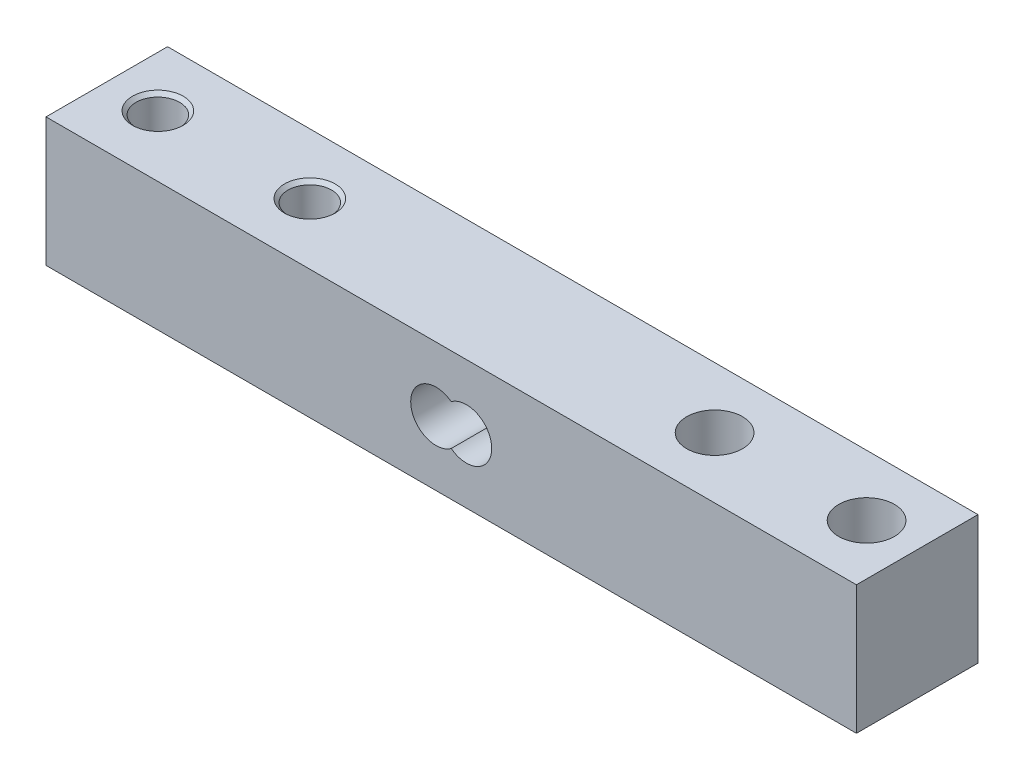
ISO-10303-21;
HEADER;
FILE_DESCRIPTION(('STEP AP214'),'2;1');
FILE_NAME('part.step','',(''),(''),'','','');
FILE_SCHEMA(('AUTOMOTIVE_DESIGN { 1 0 10303 214 1 1 1 1 }'));
ENDSEC;
DATA;
#1=APPLICATION_CONTEXT('core data for automotive mechanical design processes');
#2=APPLICATION_PROTOCOL_DEFINITION('international standard','automotive_design',2000,#1);
#3=PRODUCT_CONTEXT('',#1,'mechanical');
#4=PRODUCT('Part','Part','',(#3));
#5=PRODUCT_RELATED_PRODUCT_CATEGORY('part','',(#4));
#6=PRODUCT_DEFINITION_FORMATION('','',#4);
#7=PRODUCT_DEFINITION_CONTEXT('part definition',#1,'design');
#8=PRODUCT_DEFINITION('design','',#6,#7);
#9=PRODUCT_DEFINITION_SHAPE('','',#8);
#10=(LENGTH_UNIT() NAMED_UNIT(*) SI_UNIT(.MILLI.,.METRE.));
#11=(NAMED_UNIT(*) PLANE_ANGLE_UNIT() SI_UNIT($,.RADIAN.));
#12=(NAMED_UNIT(*) SI_UNIT($,.STERADIAN.) SOLID_ANGLE_UNIT());
#13=UNCERTAINTY_MEASURE_WITH_UNIT(LENGTH_MEASURE(1.E-05),#10,'distance_accuracy_value','');
#14=(GEOMETRIC_REPRESENTATION_CONTEXT(3) GLOBAL_UNCERTAINTY_ASSIGNED_CONTEXT((#13)) GLOBAL_UNIT_ASSIGNED_CONTEXT((#10,
#11,#12)) REPRESENTATION_CONTEXT('',''));
#15=CARTESIAN_POINT('',(0.,0.,0.));
#16=DIRECTION('',(0.,0.,1.));
#17=DIRECTION('',(1.,0.,0.));
#18=AXIS2_PLACEMENT_3D('',#15,#16,#17);
#19=CARTESIAN_POINT('',(-80.,0.,12.));
#20=DIRECTION('',(-1.,0.,0.));
#21=DIRECTION('',(0.,0.,1.));
#22=AXIS2_PLACEMENT_3D('',#19,#20,#21);
#23=PLANE('',#22);
#24=DIRECTION('',(0.,1.,0.));
#25=VECTOR('',#24,1.);
#26=CARTESIAN_POINT('',(-80.,0.,0.));
#27=LINE('',#26,#25);
#28=CARTESIAN_POINT('',(-80.,0.,0.));
#29=VERTEX_POINT('',#28);
#30=CARTESIAN_POINT('',(-80.,12.7,0.));
#31=VERTEX_POINT('',#30);
#32=EDGE_CURVE('E128',#29,#31,#27,.T.);
#33=ORIENTED_EDGE('',*,*,#32,.F.);
#34=DIRECTION('',(0.,0.,-1.));
#35=VECTOR('',#34,1.);
#36=CARTESIAN_POINT('',(-80.,0.,12.));
#37=LINE('',#36,#35);
#38=CARTESIAN_POINT('',(-80.,0.,12.));
#39=VERTEX_POINT('',#38);
#40=EDGE_CURVE('E11',#39,#29,#37,.T.);
#41=ORIENTED_EDGE('',*,*,#40,.F.);
#42=DIRECTION('',(0.,1.,0.));
#43=VECTOR('',#42,1.);
#44=CARTESIAN_POINT('',(-80.,0.,12.));
#45=LINE('',#44,#43);
#46=CARTESIAN_POINT('',(-80.,12.7,12.));
#47=VERTEX_POINT('',#46);
#48=EDGE_CURVE('E112',#39,#47,#45,.T.);
#49=ORIENTED_EDGE('',*,*,#48,.T.);
#50=DIRECTION('',(0.,0.,-1.));
#51=VECTOR('',#50,1.);
#52=CARTESIAN_POINT('',(-80.,12.7,12.));
#53=LINE('',#52,#51);
#54=EDGE_CURVE('E56',#47,#31,#53,.T.);
#55=ORIENTED_EDGE('',*,*,#54,.T.);
#56=EDGE_LOOP('',(#33,#41,#49,#55));
#57=FACE_BOUND('',#56,.T.);
#58=ADVANCED_FACE('F37',(#57),#23,.T.);
#59=CARTESIAN_POINT('',(0.,0.,12.));
#60=DIRECTION('',(0.,-1.,0.));
#61=DIRECTION('',(0.,0.,-1.));
#62=AXIS2_PLACEMENT_3D('',#59,#60,#61);
#63=PLANE('',#62);
#64=CARTESIAN_POINT('',(-20.,0.,6.));
#65=DIRECTION('',(0.,-1.,0.));
#66=DIRECTION('',(0.,0.,-1.));
#67=AXIS2_PLACEMENT_3D('',#64,#65,#66);
#68=CIRCLE('',#67,3.);
#69=CARTESIAN_POINT('',(-20.,0.,3.));
#70=VERTEX_POINT('',#69);
#71=EDGE_CURVE('E293',#70,#70,#68,.T.);
#72=ORIENTED_EDGE('',*,*,#71,.F.);
#73=EDGE_LOOP('',(#72));
#74=FACE_BOUND('',#73,.T.);
#75=CARTESIAN_POINT('',(-5.,0.,6.));
#76=DIRECTION('',(0.,-1.,0.));
#77=DIRECTION('',(0.,0.,-1.));
#78=AXIS2_PLACEMENT_3D('',#75,#76,#77);
#79=CIRCLE('',#78,3.);
#80=CARTESIAN_POINT('',(-5.,0.,3.));
#81=VERTEX_POINT('',#80);
#82=EDGE_CURVE('E299',#81,#81,#79,.T.);
#83=ORIENTED_EDGE('',*,*,#82,.F.);
#84=EDGE_LOOP('',(#83));
#85=FACE_BOUND('',#84,.T.);
#86=CARTESIAN_POINT('',(-75.,0.,5.95895265821062));
#87=DIRECTION('',(0.,1.,0.));
#88=DIRECTION('',(0.,0.,1.));
#89=AXIS2_PLACEMENT_3D('',#86,#87,#88);
#90=CIRCLE('',#89,2.14999999999999);
#91=CARTESIAN_POINT('',(-75.,0.,8.1089526582106));
#92=VERTEX_POINT('',#91);
#93=EDGE_CURVE('E314',#92,#92,#90,.T.);
#94=ORIENTED_EDGE('',*,*,#93,.T.);
#95=EDGE_LOOP('',(#94));
#96=FACE_BOUND('',#95,.T.);
#97=CARTESIAN_POINT('',(-60.,0.,5.95895265821062));
#98=DIRECTION('',(0.,1.,0.));
#99=DIRECTION('',(0.,0.,1.));
#100=AXIS2_PLACEMENT_3D('',#97,#98,#99);
#101=CIRCLE('',#100,2.14999999999999);
#102=CARTESIAN_POINT('',(-60.,0.,8.1089526582106));
#103=VERTEX_POINT('',#102);
#104=EDGE_CURVE('E125',#103,#103,#101,.T.);
#105=ORIENTED_EDGE('',*,*,#104,.T.);
#106=EDGE_LOOP('',(#105));
#107=FACE_BOUND('',#106,.T.);
#108=DIRECTION('',(-1.,0.,0.));
#109=VECTOR('',#108,1.);
#110=CARTESIAN_POINT('',(0.,0.,0.));
#111=LINE('',#110,#109);
#112=CARTESIAN_POINT('',(0.,0.,0.));
#113=VERTEX_POINT('',#112);
#114=EDGE_CURVE('E101',#113,#29,#111,.T.);
#115=ORIENTED_EDGE('',*,*,#114,.F.);
#116=DIRECTION('',(0.,0.,-1.));
#117=VECTOR('',#116,1.);
#118=CARTESIAN_POINT('',(0.,0.,12.));
#119=LINE('',#118,#117);
#120=CARTESIAN_POINT('',(0.,0.,12.));
#121=VERTEX_POINT('',#120);
#122=EDGE_CURVE('E47',#121,#113,#119,.T.);
#123=ORIENTED_EDGE('',*,*,#122,.F.);
#124=DIRECTION('',(-1.,0.,0.));
#125=VECTOR('',#124,1.);
#126=CARTESIAN_POINT('',(0.,0.,12.));
#127=LINE('',#126,#125);
#128=EDGE_CURVE('E99',#121,#39,#127,.T.);
#129=ORIENTED_EDGE('',*,*,#128,.T.);
#130=ORIENTED_EDGE('',*,*,#40,.T.);
#131=EDGE_LOOP('',(#115,#123,#129,#130));
#132=FACE_BOUND('',#131,.T.);
#133=ADVANCED_FACE('F98',(#74,#85,#96,#107,#132),#63,.T.);
#134=CARTESIAN_POINT('',(0.,0.,12.));
#135=DIRECTION('',(1.,0.,0.));
#136=DIRECTION('',(0.,1.,0.));
#137=AXIS2_PLACEMENT_3D('',#134,#135,#136);
#138=PLANE('',#137);
#139=DIRECTION('',(0.,-1.,0.));
#140=VECTOR('',#139,1.);
#141=CARTESIAN_POINT('',(0.,0.,0.));
#142=LINE('',#141,#140);
#143=CARTESIAN_POINT('',(0.,12.7,0.));
#144=VERTEX_POINT('',#143);
#145=EDGE_CURVE('E131',#144,#113,#142,.T.);
#146=ORIENTED_EDGE('',*,*,#145,.F.);
#147=DIRECTION('',(0.,0.,-1.));
#148=VECTOR('',#147,1.);
#149=CARTESIAN_POINT('',(0.,12.7,12.));
#150=LINE('',#149,#148);
#151=CARTESIAN_POINT('',(0.,12.7,12.));
#152=VERTEX_POINT('',#151);
#153=EDGE_CURVE('E75',#152,#144,#150,.T.);
#154=ORIENTED_EDGE('',*,*,#153,.F.);
#155=DIRECTION('',(0.,-1.,0.));
#156=VECTOR('',#155,1.);
#157=CARTESIAN_POINT('',(0.,0.,12.));
#158=LINE('',#157,#156);
#159=EDGE_CURVE('E111',#152,#121,#158,.T.);
#160=ORIENTED_EDGE('',*,*,#159,.T.);
#161=ORIENTED_EDGE('',*,*,#122,.T.);
#162=EDGE_LOOP('',(#146,#154,#160,#161));
#163=FACE_BOUND('',#162,.T.);
#164=ADVANCED_FACE('F114',(#163),#138,.T.);
#165=CARTESIAN_POINT('',(-38.5,6.35,12.));
#166=DIRECTION('',(0.,0.,-1.));
#167=DIRECTION('',(-1.,0.,0.));
#168=AXIS2_PLACEMENT_3D('',#165,#166,#167);
#169=CYLINDRICAL_SURFACE('',#168,2.5);
#170=CARTESIAN_POINT('',(-38.5,6.35,0.));
#171=DIRECTION('',(0.,0.,1.));
#172=DIRECTION('',(1.,0.,0.));
#173=AXIS2_PLACEMENT_3D('',#170,#171,#172);
#174=CIRCLE('',#173,2.5);
#175=CARTESIAN_POINT('',(-40.,4.35,0.));
#176=VERTEX_POINT('',#175);
#177=CARTESIAN_POINT('',(-40.,8.35,0.));
#178=VERTEX_POINT('',#177);
#179=EDGE_CURVE('E121',#176,#178,#174,.T.);
#180=ORIENTED_EDGE('',*,*,#179,.F.);
#181=DIRECTION('',(0.,0.,-1.));
#182=VECTOR('',#181,1.);
#183=CARTESIAN_POINT('',(-40.,4.35,12.));
#184=LINE('',#183,#182);
#185=CARTESIAN_POINT('',(-40.,4.35,12.));
#186=VERTEX_POINT('',#185);
#187=EDGE_CURVE('E41',#186,#176,#184,.T.);
#188=ORIENTED_EDGE('',*,*,#187,.F.);
#189=CARTESIAN_POINT('',(-38.5,6.35,12.));
#190=DIRECTION('',(0.,0.,1.));
#191=DIRECTION('',(1.,0.,0.));
#192=AXIS2_PLACEMENT_3D('',#189,#190,#191);
#193=CIRCLE('',#192,2.5);
#194=CARTESIAN_POINT('',(-40.,8.35,12.));
#195=VERTEX_POINT('',#194);
#196=EDGE_CURVE('E136',#186,#195,#193,.T.);
#197=ORIENTED_EDGE('',*,*,#196,.T.);
#198=DIRECTION('',(0.,0.,-1.));
#199=VECTOR('',#198,1.);
#200=CARTESIAN_POINT('',(-40.,8.35,12.));
#201=LINE('',#200,#199);
#202=EDGE_CURVE('E117',#195,#178,#201,.T.);
#203=ORIENTED_EDGE('',*,*,#202,.T.);
#204=EDGE_LOOP('',(#180,#188,#197,#203));
#205=FACE_BOUND('',#204,.T.);
#206=ADVANCED_FACE('F39',(#205),#169,.F.);
#207=CARTESIAN_POINT('',(-41.5,6.35,12.));
#208=DIRECTION('',(0.,0.,-1.));
#209=DIRECTION('',(-1.,0.,0.));
#210=AXIS2_PLACEMENT_3D('',#207,#208,#209);
#211=CYLINDRICAL_SURFACE('',#210,2.5);
#212=CARTESIAN_POINT('',(-41.5,6.35,0.));
#213=DIRECTION('',(0.,0.,1.));
#214=DIRECTION('',(1.,0.,0.));
#215=AXIS2_PLACEMENT_3D('',#212,#213,#214);
#216=CIRCLE('',#215,2.5);
#217=EDGE_CURVE('E124',#178,#176,#216,.T.);
#218=ORIENTED_EDGE('',*,*,#217,.F.);
#219=ORIENTED_EDGE('',*,*,#202,.F.);
#220=CARTESIAN_POINT('',(-41.5,6.35,12.));
#221=DIRECTION('',(0.,0.,1.));
#222=DIRECTION('',(1.,0.,0.));
#223=AXIS2_PLACEMENT_3D('',#220,#221,#222);
#224=CIRCLE('',#223,2.5);
#225=EDGE_CURVE('E143',#195,#186,#224,.T.);
#226=ORIENTED_EDGE('',*,*,#225,.T.);
#227=ORIENTED_EDGE('',*,*,#187,.T.);
#228=EDGE_LOOP('',(#218,#219,#226,#227));
#229=FACE_BOUND('',#228,.T.);
#230=ADVANCED_FACE('F141',(#229),#211,.F.);
#231=CARTESIAN_POINT('',(0.,12.7,12.));
#232=DIRECTION('',(0.,1.,0.));
#233=DIRECTION('',(0.,0.,1.));
#234=AXIS2_PLACEMENT_3D('',#231,#232,#233);
#235=PLANE('',#234);
#236=CARTESIAN_POINT('',(-20.,12.7,6.));
#237=DIRECTION('',(0.,-1.,0.));
#238=DIRECTION('',(0.,0.,-1.));
#239=AXIS2_PLACEMENT_3D('',#236,#237,#238);
#240=CIRCLE('',#239,2.75);
#241=CARTESIAN_POINT('',(-20.,12.7,3.25));
#242=VERTEX_POINT('',#241);
#243=EDGE_CURVE('E295',#242,#242,#240,.T.);
#244=ORIENTED_EDGE('',*,*,#243,.T.);
#245=EDGE_LOOP('',(#244));
#246=FACE_BOUND('',#245,.T.);
#247=CARTESIAN_POINT('',(-5.,12.7,6.));
#248=DIRECTION('',(0.,-1.,0.));
#249=DIRECTION('',(0.,0.,-1.));
#250=AXIS2_PLACEMENT_3D('',#247,#248,#249);
#251=CIRCLE('',#250,2.75);
#252=CARTESIAN_POINT('',(-5.,12.7,3.25));
#253=VERTEX_POINT('',#252);
#254=EDGE_CURVE('E305',#253,#253,#251,.T.);
#255=ORIENTED_EDGE('',*,*,#254,.T.);
#256=EDGE_LOOP('',(#255));
#257=FACE_BOUND('',#256,.T.);
#258=CARTESIAN_POINT('',(-75.,12.7,5.95895265821062));
#259=DIRECTION('',(0.,1.,0.));
#260=DIRECTION('',(0.,0.,1.));
#261=AXIS2_PLACEMENT_3D('',#258,#259,#260);
#262=CIRCLE('',#261,2.5);
#263=CARTESIAN_POINT('',(-75.,12.7,8.45895265821062));
#264=VERTEX_POINT('',#263);
#265=EDGE_CURVE('E308',#264,#264,#262,.T.);
#266=ORIENTED_EDGE('',*,*,#265,.F.);
#267=EDGE_LOOP('',(#266));
#268=FACE_BOUND('',#267,.T.);
#269=CARTESIAN_POINT('',(-60.,12.7,5.95895265821062));
#270=DIRECTION('',(0.,1.,0.));
#271=DIRECTION('',(0.,0.,1.));
#272=AXIS2_PLACEMENT_3D('',#269,#270,#271);
#273=CIRCLE('',#272,2.5);
#274=CARTESIAN_POINT('',(-60.,12.7,8.45895265821062));
#275=VERTEX_POINT('',#274);
#276=EDGE_CURVE('E317',#275,#275,#273,.T.);
#277=ORIENTED_EDGE('',*,*,#276,.F.);
#278=EDGE_LOOP('',(#277));
#279=FACE_BOUND('',#278,.T.);
#280=DIRECTION('',(1.,0.,0.));
#281=VECTOR('',#280,1.);
#282=CARTESIAN_POINT('',(0.,12.7,0.));
#283=LINE('',#282,#281);
#284=EDGE_CURVE('E133',#31,#144,#283,.T.);
#285=ORIENTED_EDGE('',*,*,#284,.F.);
#286=ORIENTED_EDGE('',*,*,#54,.F.);
#287=DIRECTION('',(1.,0.,0.));
#288=VECTOR('',#287,1.);
#289=CARTESIAN_POINT('',(0.,12.7,12.));
#290=LINE('',#289,#288);
#291=EDGE_CURVE('E115',#47,#152,#290,.T.);
#292=ORIENTED_EDGE('',*,*,#291,.T.);
#293=ORIENTED_EDGE('',*,*,#153,.T.);
#294=EDGE_LOOP('',(#285,#286,#292,#293));
#295=FACE_BOUND('',#294,.T.);
#296=ADVANCED_FACE('F150',(#246,#257,#268,#279,#295),#235,.T.);
#297=CARTESIAN_POINT('',(0.,0.,12.));
#298=DIRECTION('',(0.,0.,1.));
#299=DIRECTION('',(1.,0.,0.));
#300=AXIS2_PLACEMENT_3D('',#297,#298,#299);
#301=PLANE('',#300);
#302=ORIENTED_EDGE('',*,*,#196,.F.);
#303=ORIENTED_EDGE('',*,*,#225,.F.);
#304=EDGE_LOOP('',(#302,#303));
#305=FACE_BOUND('',#304,.T.);
#306=ORIENTED_EDGE('',*,*,#48,.F.);
#307=ORIENTED_EDGE('',*,*,#128,.F.);
#308=ORIENTED_EDGE('',*,*,#159,.F.);
#309=ORIENTED_EDGE('',*,*,#291,.F.);
#310=EDGE_LOOP('',(#306,#307,#308,#309));
#311=FACE_BOUND('',#310,.T.);
#312=ADVANCED_FACE('F109',(#305,#311),#301,.T.);
#313=CARTESIAN_POINT('',(0.,0.,0.));
#314=DIRECTION('',(0.,0.,1.));
#315=DIRECTION('',(1.,0.,0.));
#316=AXIS2_PLACEMENT_3D('',#313,#314,#315);
#317=PLANE('',#316);
#318=ORIENTED_EDGE('',*,*,#179,.T.);
#319=ORIENTED_EDGE('',*,*,#217,.T.);
#320=EDGE_LOOP('',(#318,#319));
#321=FACE_BOUND('',#320,.T.);
#322=ORIENTED_EDGE('',*,*,#32,.T.);
#323=ORIENTED_EDGE('',*,*,#284,.T.);
#324=ORIENTED_EDGE('',*,*,#145,.T.);
#325=ORIENTED_EDGE('',*,*,#114,.T.);
#326=EDGE_LOOP('',(#322,#323,#324,#325));
#327=FACE_BOUND('',#326,.T.);
#328=ADVANCED_FACE('F145',(#321,#327),#317,.F.);
#329=CARTESIAN_POINT('',(-60.,12.7,5.95895265821062));
#330=DIRECTION('',(0.,1.,0.));
#331=DIRECTION('',(0.,0.,1.));
#332=AXIS2_PLACEMENT_3D('',#329,#330,#331);
#333=CYLINDRICAL_SURFACE('',#332,2.14999999999999);
#334=ORIENTED_EDGE('',*,*,#104,.F.);
#335=EDGE_LOOP('',(#334));
#336=FACE_BOUND('',#335,.T.);
#337=CARTESIAN_POINT('',(-60.,12.35,5.95895265821062));
#338=DIRECTION('',(0.,1.,0.));
#339=DIRECTION('',(0.,0.,1.));
#340=AXIS2_PLACEMENT_3D('',#337,#338,#339);
#341=CIRCLE('',#340,2.15);
#342=CARTESIAN_POINT('',(-60.,12.35,8.10895265821062));
#343=VERTEX_POINT('',#342);
#344=EDGE_CURVE('E320',#343,#343,#341,.T.);
#345=ORIENTED_EDGE('',*,*,#344,.T.);
#346=EDGE_LOOP('',(#345));
#347=FACE_BOUND('',#346,.T.);
#348=ADVANCED_FACE('F148',(#336,#347),#333,.F.);
#349=CARTESIAN_POINT('',(-60.,12.7,5.95895265821062));
#350=DIRECTION('',(0.,1.,0.));
#351=DIRECTION('',(0.,0.,1.));
#352=AXIS2_PLACEMENT_3D('',#349,#350,#351);
#353=CONICAL_SURFACE('',#352,2.5,0.785398163397448);
#354=ORIENTED_EDGE('',*,*,#344,.F.);
#355=EDGE_LOOP('',(#354));
#356=FACE_BOUND('',#355,.T.);
#357=ORIENTED_EDGE('',*,*,#276,.T.);
#358=EDGE_LOOP('',(#357));
#359=FACE_BOUND('',#358,.T.);
#360=ADVANCED_FACE('F202',(#356,#359),#353,.F.);
#361=CARTESIAN_POINT('',(-75.,12.7,5.95895265821062));
#362=DIRECTION('',(0.,1.,0.));
#363=DIRECTION('',(0.,0.,1.));
#364=AXIS2_PLACEMENT_3D('',#361,#362,#363);
#365=CYLINDRICAL_SURFACE('',#364,2.14999999999999);
#366=ORIENTED_EDGE('',*,*,#93,.F.);
#367=EDGE_LOOP('',(#366));
#368=FACE_BOUND('',#367,.T.);
#369=CARTESIAN_POINT('',(-75.,12.35,5.95895265821062));
#370=DIRECTION('',(0.,1.,0.));
#371=DIRECTION('',(0.,0.,1.));
#372=AXIS2_PLACEMENT_3D('',#369,#370,#371);
#373=CIRCLE('',#372,2.15);
#374=CARTESIAN_POINT('',(-75.,12.35,8.10895265821062));
#375=VERTEX_POINT('',#374);
#376=EDGE_CURVE('E311',#375,#375,#373,.T.);
#377=ORIENTED_EDGE('',*,*,#376,.T.);
#378=EDGE_LOOP('',(#377));
#379=FACE_BOUND('',#378,.T.);
#380=ADVANCED_FACE('F212',(#368,#379),#365,.F.);
#381=CARTESIAN_POINT('',(-75.,12.7,5.95895265821062));
#382=DIRECTION('',(0.,1.,0.));
#383=DIRECTION('',(0.,0.,1.));
#384=AXIS2_PLACEMENT_3D('',#381,#382,#383);
#385=CONICAL_SURFACE('',#384,2.5,0.785398163397448);
#386=ORIENTED_EDGE('',*,*,#376,.F.);
#387=EDGE_LOOP('',(#386));
#388=FACE_BOUND('',#387,.T.);
#389=ORIENTED_EDGE('',*,*,#265,.T.);
#390=EDGE_LOOP('',(#389));
#391=FACE_BOUND('',#390,.T.);
#392=ADVANCED_FACE('F222',(#388,#391),#385,.F.);
#393=CARTESIAN_POINT('',(-5.,0.,6.));
#394=DIRECTION('',(0.,-1.,0.));
#395=DIRECTION('',(0.,0.,-1.));
#396=AXIS2_PLACEMENT_3D('',#393,#394,#395);
#397=CYLINDRICAL_SURFACE('',#396,2.75);
#398=ORIENTED_EDGE('',*,*,#254,.F.);
#399=EDGE_LOOP('',(#398));
#400=FACE_BOUND('',#399,.T.);
#401=CARTESIAN_POINT('',(-5.,0.250000000000002,6.));
#402=DIRECTION('',(0.,-1.,0.));
#403=DIRECTION('',(0.,0.,-1.));
#404=AXIS2_PLACEMENT_3D('',#401,#402,#403);
#405=CIRCLE('',#404,2.75);
#406=CARTESIAN_POINT('',(-5.,0.250000000000002,3.25));
#407=VERTEX_POINT('',#406);
#408=EDGE_CURVE('E302',#407,#407,#405,.T.);
#409=ORIENTED_EDGE('',*,*,#408,.T.);
#410=EDGE_LOOP('',(#409));
#411=FACE_BOUND('',#410,.T.);
#412=ADVANCED_FACE('F232',(#400,#411),#397,.F.);
#413=CARTESIAN_POINT('',(-5.,0.,6.));
#414=DIRECTION('',(0.,-1.,0.));
#415=DIRECTION('',(0.,0.,-1.));
#416=AXIS2_PLACEMENT_3D('',#413,#414,#415);
#417=CONICAL_SURFACE('',#416,3.,0.785398163397447);
#418=ORIENTED_EDGE('',*,*,#408,.F.);
#419=EDGE_LOOP('',(#418));
#420=FACE_BOUND('',#419,.T.);
#421=ORIENTED_EDGE('',*,*,#82,.T.);
#422=EDGE_LOOP('',(#421));
#423=FACE_BOUND('',#422,.T.);
#424=ADVANCED_FACE('F253',(#420,#423),#417,.F.);
#425=CARTESIAN_POINT('',(-20.,0.,6.));
#426=DIRECTION('',(0.,-1.,0.));
#427=DIRECTION('',(0.,0.,-1.));
#428=AXIS2_PLACEMENT_3D('',#425,#426,#427);
#429=CYLINDRICAL_SURFACE('',#428,2.75);
#430=ORIENTED_EDGE('',*,*,#243,.F.);
#431=EDGE_LOOP('',(#430));
#432=FACE_BOUND('',#431,.T.);
#433=CARTESIAN_POINT('',(-20.,0.250000000000002,6.));
#434=DIRECTION('',(0.,-1.,0.));
#435=DIRECTION('',(0.,0.,-1.));
#436=AXIS2_PLACEMENT_3D('',#433,#434,#435);
#437=CIRCLE('',#436,2.75);
#438=CARTESIAN_POINT('',(-20.,0.250000000000002,3.25));
#439=VERTEX_POINT('',#438);
#440=EDGE_CURVE('E290',#439,#439,#437,.T.);
#441=ORIENTED_EDGE('',*,*,#440,.T.);
#442=EDGE_LOOP('',(#441));
#443=FACE_BOUND('',#442,.T.);
#444=ADVANCED_FACE('F263',(#432,#443),#429,.F.);
#445=CARTESIAN_POINT('',(-20.,0.,6.));
#446=DIRECTION('',(0.,-1.,0.));
#447=DIRECTION('',(0.,0.,-1.));
#448=AXIS2_PLACEMENT_3D('',#445,#446,#447);
#449=CONICAL_SURFACE('',#448,3.,0.785398163397445);
#450=ORIENTED_EDGE('',*,*,#440,.F.);
#451=EDGE_LOOP('',(#450));
#452=FACE_BOUND('',#451,.T.);
#453=ORIENTED_EDGE('',*,*,#71,.T.);
#454=EDGE_LOOP('',(#453));
#455=FACE_BOUND('',#454,.T.);
#456=ADVANCED_FACE('F273',(#452,#455),#449,.F.);
#457=CLOSED_SHELL('',(#58,#133,#164,#206,#230,#296,#312,#328,#348,#360,#380,#392,#412,#424,#444,#456));
#458=MANIFOLD_SOLID_BREP('B2',#457);
#459=ADVANCED_BREP_SHAPE_REPRESENTATION('',(#18,#458),#14);
#460=SHAPE_DEFINITION_REPRESENTATION(#9,#459);
ENDSEC;
END-ISO-10303-21;
